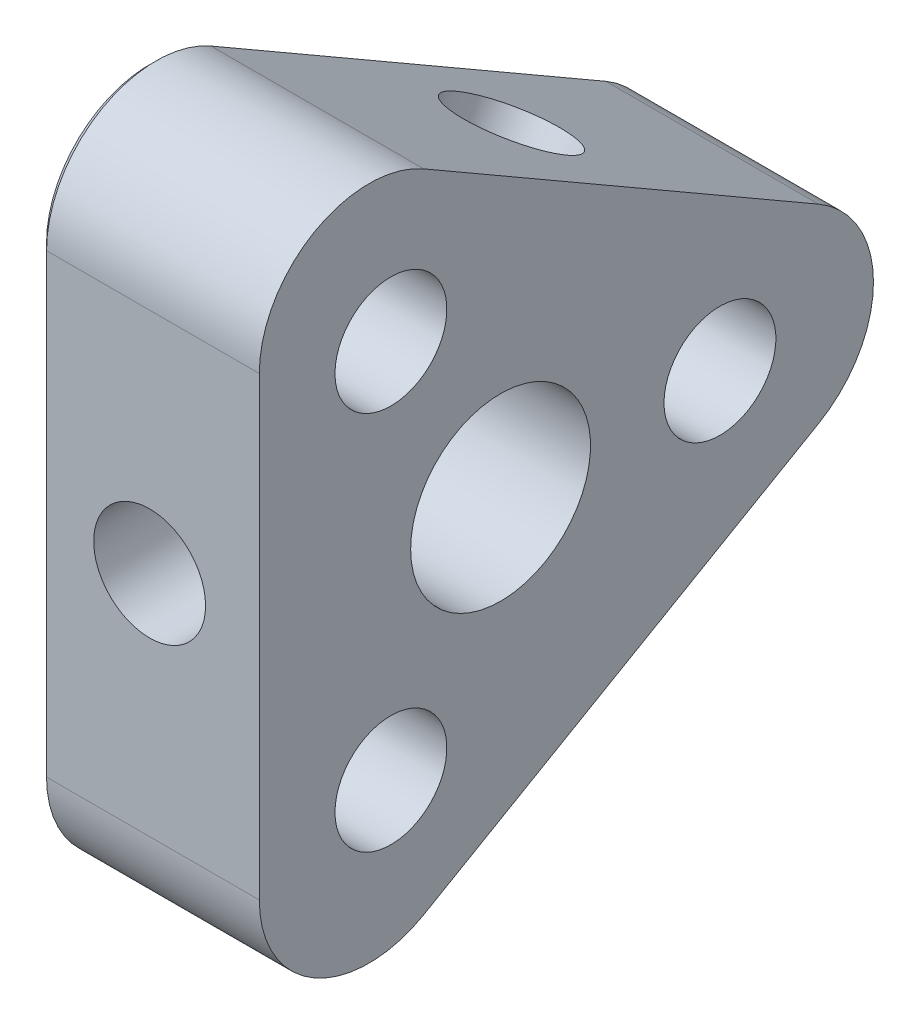
ISO-10303-21;
HEADER;
FILE_DESCRIPTION(('STEP AP214'),'2;1');
FILE_NAME('part.step','',(''),(''),'','','');
FILE_SCHEMA(('AUTOMOTIVE_DESIGN { 1 0 10303 214 1 1 1 1 }'));
ENDSEC;
DATA;
#1=APPLICATION_CONTEXT('core data for automotive mechanical design processes');
#2=APPLICATION_PROTOCOL_DEFINITION('international standard','automotive_design',2000,#1);
#3=PRODUCT_CONTEXT('',#1,'mechanical');
#4=PRODUCT('Part','Part','',(#3));
#5=PRODUCT_RELATED_PRODUCT_CATEGORY('part','',(#4));
#6=PRODUCT_DEFINITION_FORMATION('','',#4);
#7=PRODUCT_DEFINITION_CONTEXT('part definition',#1,'design');
#8=PRODUCT_DEFINITION('design','',#6,#7);
#9=PRODUCT_DEFINITION_SHAPE('','',#8);
#10=(LENGTH_UNIT() NAMED_UNIT(*) SI_UNIT(.MILLI.,.METRE.));
#11=(NAMED_UNIT(*) PLANE_ANGLE_UNIT() SI_UNIT($,.RADIAN.));
#12=(NAMED_UNIT(*) SI_UNIT($,.STERADIAN.) SOLID_ANGLE_UNIT());
#13=UNCERTAINTY_MEASURE_WITH_UNIT(LENGTH_MEASURE(1.E-05),#10,'distance_accuracy_value','');
#14=(GEOMETRIC_REPRESENTATION_CONTEXT(3) GLOBAL_UNCERTAINTY_ASSIGNED_CONTEXT((#13)) GLOBAL_UNIT_ASSIGNED_CONTEXT((#10,
#11,#12)) REPRESENTATION_CONTEXT('',''));
#15=CARTESIAN_POINT('',(0.,0.,0.));
#16=DIRECTION('',(0.,0.,1.));
#17=DIRECTION('',(1.,0.,0.));
#18=AXIS2_PLACEMENT_3D('',#15,#16,#17);
#19=CARTESIAN_POINT('',(38.,10.3923048454133,6.));
#20=DIRECTION('',(-1.,0.,0.));
#21=DIRECTION('',(0.,0.,1.));
#22=AXIS2_PLACEMENT_3D('',#19,#20,#21);
#23=CYLINDRICAL_SURFACE('',#22,4.99999999999999);
#24=DIRECTION('',(-1.,0.,0.));
#25=VECTOR('',#24,1.);
#26=CARTESIAN_POINT('',(38.,14.7224318643355,3.50000000000001));
#27=LINE('',#26,#25);
#28=CARTESIAN_POINT('',(38.,14.7224318643355,3.50000000000001));
#29=VERTEX_POINT('',#28);
#30=CARTESIAN_POINT('',(28.3000000000062,14.7224318643355,3.50000000000001));
#31=VERTEX_POINT('',#30);
#32=EDGE_CURVE('E110',#29,#31,#27,.T.);
#33=ORIENTED_EDGE('',*,*,#32,.T.);
#34=CARTESIAN_POINT('',(28.3000000000062,10.3923048454133,6.));
#35=DIRECTION('',(-1.,0.,0.));
#36=DIRECTION('',(0.,0.,1.));
#37=AXIS2_PLACEMENT_3D('',#34,#35,#36);
#38=CIRCLE('',#37,4.99999999999999);
#39=CARTESIAN_POINT('',(28.3000000000062,10.3923048454133,11.));
#40=VERTEX_POINT('',#39);
#41=EDGE_CURVE('E193',#31,#40,#38,.F.);
#42=ORIENTED_EDGE('',*,*,#41,.T.);
#43=DIRECTION('',(-1.,0.,0.));
#44=VECTOR('',#43,1.);
#45=CARTESIAN_POINT('',(38.,10.3923048454133,11.));
#46=LINE('',#45,#44);
#47=CARTESIAN_POINT('',(38.,10.3923048454133,11.));
#48=VERTEX_POINT('',#47);
#49=EDGE_CURVE('E132',#48,#40,#46,.T.);
#50=ORIENTED_EDGE('',*,*,#49,.F.);
#51=CARTESIAN_POINT('',(38.,10.3923048454133,6.));
#52=DIRECTION('',(-1.,0.,0.));
#53=DIRECTION('',(0.,0.,1.));
#54=AXIS2_PLACEMENT_3D('',#51,#52,#53);
#55=CIRCLE('',#54,4.99999999999999);
#56=EDGE_CURVE('E125',#48,#29,#55,.T.);
#57=ORIENTED_EDGE('',*,*,#56,.T.);
#58=EDGE_LOOP('',(#33,#42,#50,#57));
#59=FACE_BOUND('',#58,.T.);
#60=ADVANCED_FACE('F33',(#59),#23,.T.);
#61=CARTESIAN_POINT('',(38.,-10.3923048454133,11.));
#62=DIRECTION('',(0.,0.,1.));
#63=DIRECTION('',(1.,0.,0.));
#64=AXIS2_PLACEMENT_3D('',#61,#62,#63);
#65=PLANE('',#64);
#66=CARTESIAN_POINT('',(33.,0.,11.));
#67=DIRECTION('',(0.,0.,1.));
#68=DIRECTION('',(1.,0.,0.));
#69=AXIS2_PLACEMENT_3D('',#66,#67,#68);
#70=CIRCLE('',#69,2.54999999999998);
#71=CARTESIAN_POINT('',(35.55,0.,11.));
#72=VERTEX_POINT('',#71);
#73=EDGE_CURVE('E216',#72,#72,#70,.T.);
#74=ORIENTED_EDGE('',*,*,#73,.F.);
#75=EDGE_LOOP('',(#74));
#76=FACE_BOUND('',#75,.T.);
#77=ORIENTED_EDGE('',*,*,#49,.T.);
#78=DIRECTION('',(0.,-1.,0.));
#79=VECTOR('',#78,1.);
#80=CARTESIAN_POINT('',(28.3000000000062,-10.3923048454133,11.));
#81=LINE('',#80,#79);
#82=CARTESIAN_POINT('',(28.3000000000062,-10.3923048454133,11.));
#83=VERTEX_POINT('',#82);
#84=EDGE_CURVE('E189',#40,#83,#81,.T.);
#85=ORIENTED_EDGE('',*,*,#84,.T.);
#86=DIRECTION('',(-1.,0.,0.));
#87=VECTOR('',#86,1.);
#88=CARTESIAN_POINT('',(38.,-10.3923048454133,11.));
#89=LINE('',#88,#87);
#90=CARTESIAN_POINT('',(38.,-10.3923048454133,11.));
#91=VERTEX_POINT('',#90);
#92=EDGE_CURVE('E150',#91,#83,#89,.T.);
#93=ORIENTED_EDGE('',*,*,#92,.F.);
#94=DIRECTION('',(0.,1.,0.));
#95=VECTOR('',#94,1.);
#96=CARTESIAN_POINT('',(38.,-10.3923048454133,11.));
#97=LINE('',#96,#95);
#98=EDGE_CURVE('E118',#91,#48,#97,.T.);
#99=ORIENTED_EDGE('',*,*,#98,.T.);
#100=EDGE_LOOP('',(#77,#85,#93,#99));
#101=FACE_BOUND('',#100,.T.);
#102=ADVANCED_FACE('F256',(#76,#101),#65,.T.);
#103=CARTESIAN_POINT('',(38.,-10.3923048454133,6.));
#104=DIRECTION('',(-1.,0.,0.));
#105=DIRECTION('',(0.,0.,1.));
#106=AXIS2_PLACEMENT_3D('',#103,#104,#105);
#107=CYLINDRICAL_SURFACE('',#106,4.99999999999999);
#108=ORIENTED_EDGE('',*,*,#92,.T.);
#109=CARTESIAN_POINT('',(28.3000000000062,-10.3923048454133,6.));
#110=DIRECTION('',(-1.,0.,0.));
#111=DIRECTION('',(0.,0.,1.));
#112=AXIS2_PLACEMENT_3D('',#109,#110,#111);
#113=CIRCLE('',#112,4.99999999999999);
#114=CARTESIAN_POINT('',(28.3000000000062,-14.7224318643355,3.50000000000001));
#115=VERTEX_POINT('',#114);
#116=EDGE_CURVE('E186',#83,#115,#113,.F.);
#117=ORIENTED_EDGE('',*,*,#116,.T.);
#118=DIRECTION('',(-1.,0.,0.));
#119=VECTOR('',#118,1.);
#120=CARTESIAN_POINT('',(38.,-14.7224318643355,3.50000000000001));
#121=LINE('',#120,#119);
#122=CARTESIAN_POINT('',(38.,-14.7224318643355,3.50000000000001));
#123=VERTEX_POINT('',#122);
#124=EDGE_CURVE('E153',#123,#115,#121,.T.);
#125=ORIENTED_EDGE('',*,*,#124,.F.);
#126=CARTESIAN_POINT('',(38.,-10.3923048454133,6.));
#127=DIRECTION('',(-1.,0.,0.));
#128=DIRECTION('',(0.,0.,1.));
#129=AXIS2_PLACEMENT_3D('',#126,#127,#128);
#130=CIRCLE('',#129,4.99999999999999);
#131=EDGE_CURVE('E144',#123,#91,#130,.T.);
#132=ORIENTED_EDGE('',*,*,#131,.T.);
#133=EDGE_LOOP('',(#108,#117,#125,#132));
#134=FACE_BOUND('',#133,.T.);
#135=ADVANCED_FACE('F261',(#134),#107,.T.);
#136=CARTESIAN_POINT('',(38.,-4.33012701892219,-14.5));
#137=DIRECTION('',(0.,-0.866025403784438,-0.500000000000001));
#138=DIRECTION('',(0.,0.500000000000001,-0.866025403784438));
#139=AXIS2_PLACEMENT_3D('',#136,#137,#138);
#140=PLANE('',#139);
#141=ORIENTED_EDGE('',*,*,#124,.T.);
#142=DIRECTION('',(0.,0.500000000000001,-0.866025403784438));
#143=VECTOR('',#142,1.);
#144=CARTESIAN_POINT('',(28.3000000000062,-4.33012701892219,-14.5));
#145=LINE('',#144,#143);
#146=CARTESIAN_POINT('',(28.3000000000062,-4.33012701892219,-14.5));
#147=VERTEX_POINT('',#146);
#148=EDGE_CURVE('E191',#115,#147,#145,.T.);
#149=ORIENTED_EDGE('',*,*,#148,.T.);
#150=DIRECTION('',(-1.,0.,0.));
#151=VECTOR('',#150,1.);
#152=CARTESIAN_POINT('',(38.,-4.33012701892219,-14.5));
#153=LINE('',#152,#151);
#154=CARTESIAN_POINT('',(38.,-4.33012701892219,-14.5));
#155=VERTEX_POINT('',#154);
#156=EDGE_CURVE('E156',#155,#147,#153,.T.);
#157=ORIENTED_EDGE('',*,*,#156,.F.);
#158=DIRECTION('',(0.,-0.500000000000001,0.866025403784438));
#159=VECTOR('',#158,1.);
#160=CARTESIAN_POINT('',(38.,-4.33012701892219,-14.5));
#161=LINE('',#160,#159);
#162=EDGE_CURVE('E141',#155,#123,#161,.T.);
#163=ORIENTED_EDGE('',*,*,#162,.T.);
#164=EDGE_LOOP('',(#141,#149,#157,#163));
#165=FACE_BOUND('',#164,.T.);
#166=ADVANCED_FACE('F343',(#165),#140,.T.);
#167=CARTESIAN_POINT('',(38.,0.,-12.));
#168=DIRECTION('',(-1.,0.,0.));
#169=DIRECTION('',(0.,0.,1.));
#170=AXIS2_PLACEMENT_3D('',#167,#168,#169);
#171=CYLINDRICAL_SURFACE('',#170,5.);
#172=ORIENTED_EDGE('',*,*,#156,.T.);
#173=CARTESIAN_POINT('',(28.3000000000062,0.,-12.));
#174=DIRECTION('',(-1.,0.,0.));
#175=DIRECTION('',(0.,0.,1.));
#176=AXIS2_PLACEMENT_3D('',#173,#174,#175);
#177=CIRCLE('',#176,5.);
#178=CARTESIAN_POINT('',(28.3000000000062,4.3301270189222,-14.5));
#179=VERTEX_POINT('',#178);
#180=EDGE_CURVE('E55',#147,#179,#177,.F.);
#181=ORIENTED_EDGE('',*,*,#180,.T.);
#182=DIRECTION('',(-1.,0.,0.));
#183=VECTOR('',#182,1.);
#184=CARTESIAN_POINT('',(38.,4.3301270189222,-14.5));
#185=LINE('',#184,#183);
#186=CARTESIAN_POINT('',(38.,4.3301270189222,-14.5));
#187=VERTEX_POINT('',#186);
#188=EDGE_CURVE('E117',#187,#179,#185,.T.);
#189=ORIENTED_EDGE('',*,*,#188,.F.);
#190=CARTESIAN_POINT('',(38.,0.,-12.));
#191=DIRECTION('',(-1.,0.,0.));
#192=DIRECTION('',(0.,0.,1.));
#193=AXIS2_PLACEMENT_3D('',#190,#191,#192);
#194=CIRCLE('',#193,5.);
#195=EDGE_CURVE('E129',#187,#155,#194,.T.);
#196=ORIENTED_EDGE('',*,*,#195,.T.);
#197=EDGE_LOOP('',(#172,#181,#189,#196));
#198=FACE_BOUND('',#197,.T.);
#199=ADVANCED_FACE('F346',(#198),#171,.T.);
#200=CARTESIAN_POINT('',(38.,14.7224318643355,3.50000000000001));
#201=DIRECTION('',(0.,0.866025403784438,-0.5));
#202=DIRECTION('',(0.,0.5,0.866025403784438));
#203=AXIS2_PLACEMENT_3D('',#200,#201,#202);
#204=PLANE('',#203);
#205=CARTESIAN_POINT('',(33.,9.52743186433548,-5.49800394532031));
#206=DIRECTION('',(0.,0.866025403784438,-0.500000000000001));
#207=DIRECTION('',(0.,0.500000000000001,0.866025403784438));
#208=AXIS2_PLACEMENT_3D('',#205,#206,#207);
#209=CIRCLE('',#208,2.525);
#210=CARTESIAN_POINT('',(33.,10.7899318643355,-3.3112898007646));
#211=VERTEX_POINT('',#210);
#212=EDGE_CURVE('E229',#211,#211,#209,.T.);
#213=ORIENTED_EDGE('',*,*,#212,.F.);
#214=EDGE_LOOP('',(#213));
#215=FACE_BOUND('',#214,.T.);
#216=ORIENTED_EDGE('',*,*,#188,.T.);
#217=DIRECTION('',(0.,0.5,0.866025403784438));
#218=VECTOR('',#217,1.);
#219=CARTESIAN_POINT('',(28.3000000000062,14.7224318643355,3.50000000000001));
#220=LINE('',#219,#218);
#221=EDGE_CURVE('E62',#179,#31,#220,.T.);
#222=ORIENTED_EDGE('',*,*,#221,.T.);
#223=ORIENTED_EDGE('',*,*,#32,.F.);
#224=DIRECTION('',(0.,-0.5,-0.866025403784438));
#225=VECTOR('',#224,1.);
#226=CARTESIAN_POINT('',(38.,14.7224318643355,3.50000000000001));
#227=LINE('',#226,#225);
#228=EDGE_CURVE('E113',#29,#187,#227,.T.);
#229=ORIENTED_EDGE('',*,*,#228,.T.);
#230=EDGE_LOOP('',(#216,#222,#223,#229));
#231=FACE_BOUND('',#230,.T.);
#232=ADVANCED_FACE('F112',(#215,#231),#204,.T.);
#233=CARTESIAN_POINT('',(38.,10.3923048454133,6.));
#234=DIRECTION('',(-1.,0.,0.));
#235=DIRECTION('',(0.,0.,1.));
#236=AXIS2_PLACEMENT_3D('',#233,#234,#235);
#237=PLANE('',#236);
#238=CARTESIAN_POINT('',(38.,0.,0.));
#239=DIRECTION('',(-1.,0.,0.));
#240=DIRECTION('',(0.,0.,1.));
#241=AXIS2_PLACEMENT_3D('',#238,#239,#240);
#242=CIRCLE('',#241,4.09999999999999);
#243=CARTESIAN_POINT('',(38.,0.,4.09999999999999));
#244=VERTEX_POINT('',#243);
#245=EDGE_CURVE('E226',#244,#244,#242,.T.);
#246=ORIENTED_EDGE('',*,*,#245,.T.);
#247=EDGE_LOOP('',(#246));
#248=FACE_BOUND('',#247,.T.);
#249=CARTESIAN_POINT('',(38.,0.,-10.));
#250=DIRECTION('',(-1.,0.,0.));
#251=DIRECTION('',(0.,0.,1.));
#252=AXIS2_PLACEMENT_3D('',#249,#250,#251);
#253=CIRCLE('',#252,2.54999999999999);
#254=CARTESIAN_POINT('',(38.,0.,-7.45000000000001));
#255=VERTEX_POINT('',#254);
#256=EDGE_CURVE('E313',#255,#255,#253,.T.);
#257=ORIENTED_EDGE('',*,*,#256,.T.);
#258=EDGE_LOOP('',(#257));
#259=FACE_BOUND('',#258,.T.);
#260=CARTESIAN_POINT('',(38.,8.66025403784439,5.));
#261=DIRECTION('',(-1.,0.,0.));
#262=DIRECTION('',(0.,0.,1.));
#263=AXIS2_PLACEMENT_3D('',#260,#261,#262);
#264=CIRCLE('',#263,2.54999999999999);
#265=CARTESIAN_POINT('',(38.,8.66025403784439,7.54999999999999));
#266=VERTEX_POINT('',#265);
#267=EDGE_CURVE('E136',#266,#266,#264,.T.);
#268=ORIENTED_EDGE('',*,*,#267,.T.);
#269=EDGE_LOOP('',(#268));
#270=FACE_BOUND('',#269,.T.);
#271=CARTESIAN_POINT('',(38.,-8.66025403784439,5.));
#272=DIRECTION('',(-1.,0.,0.));
#273=DIRECTION('',(0.,0.,1.));
#274=AXIS2_PLACEMENT_3D('',#271,#272,#273);
#275=CIRCLE('',#274,2.54999999999999);
#276=CARTESIAN_POINT('',(38.,-8.66025403784439,7.54999999999999));
#277=VERTEX_POINT('',#276);
#278=EDGE_CURVE('E133',#277,#277,#275,.T.);
#279=ORIENTED_EDGE('',*,*,#278,.T.);
#280=EDGE_LOOP('',(#279));
#281=FACE_BOUND('',#280,.T.);
#282=ORIENTED_EDGE('',*,*,#56,.F.);
#283=ORIENTED_EDGE('',*,*,#98,.F.);
#284=ORIENTED_EDGE('',*,*,#131,.F.);
#285=ORIENTED_EDGE('',*,*,#162,.F.);
#286=ORIENTED_EDGE('',*,*,#195,.F.);
#287=ORIENTED_EDGE('',*,*,#228,.F.);
#288=EDGE_LOOP('',(#282,#283,#284,#285,#286,#287));
#289=FACE_BOUND('',#288,.T.);
#290=ADVANCED_FACE('F123',(#248,#259,#270,#281,#289),#237,.F.);
#291=CARTESIAN_POINT('',(28.,10.3923048454133,6.));
#292=DIRECTION('',(-1.,0.,0.));
#293=DIRECTION('',(0.,0.,1.));
#294=AXIS2_PLACEMENT_3D('',#291,#292,#293);
#295=PLANE('',#294);
#296=CARTESIAN_POINT('',(28.,0.,-10.));
#297=DIRECTION('',(-1.,0.,0.));
#298=DIRECTION('',(0.,0.,1.));
#299=AXIS2_PLACEMENT_3D('',#296,#297,#298);
#300=CIRCLE('',#299,2.85000000000617);
#301=CARTESIAN_POINT('',(28.,0.,-7.14999999999383));
#302=VERTEX_POINT('',#301);
#303=EDGE_CURVE('E183',#302,#302,#300,.F.);
#304=ORIENTED_EDGE('',*,*,#303,.T.);
#305=EDGE_LOOP('',(#304));
#306=FACE_BOUND('',#305,.T.);
#307=DIRECTION('',(0.,-0.500000000000001,0.866025403784438));
#308=VECTOR('',#307,1.);
#309=CARTESIAN_POINT('',(28.,-9.26647182048812,-5.34999999999694));
#310=LINE('',#309,#308);
#311=CARTESIAN_POINT('',(28.,-4.0703193977815,-14.3499999999969));
#312=VERTEX_POINT('',#311);
#313=CARTESIAN_POINT('',(28.,-14.4626242431948,3.6500000000031));
#314=VERTEX_POINT('',#313);
#315=EDGE_CURVE('E176',#312,#314,#310,.T.);
#316=ORIENTED_EDGE('',*,*,#315,.T.);
#317=CARTESIAN_POINT('',(28.,-10.3923048454133,6.));
#318=DIRECTION('',(-1.,0.,0.));
#319=DIRECTION('',(0.,0.,1.));
#320=AXIS2_PLACEMENT_3D('',#317,#318,#319);
#321=CIRCLE('',#320,4.6999999999938);
#322=CARTESIAN_POINT('',(28.,-10.3923048454133,10.6999999999938));
#323=VERTEX_POINT('',#322);
#324=EDGE_CURVE('E180',#314,#323,#321,.T.);
#325=ORIENTED_EDGE('',*,*,#324,.T.);
#326=DIRECTION('',(0.,1.,0.));
#327=VECTOR('',#326,1.);
#328=CARTESIAN_POINT('',(28.,10.3923048454133,10.6999999999938));
#329=LINE('',#328,#327);
#330=CARTESIAN_POINT('',(28.,10.3923048454133,10.6999999999938));
#331=VERTEX_POINT('',#330);
#332=EDGE_CURVE('E178',#323,#331,#329,.T.);
#333=ORIENTED_EDGE('',*,*,#332,.T.);
#334=CARTESIAN_POINT('',(28.,10.3923048454133,6.));
#335=DIRECTION('',(-1.,0.,0.));
#336=DIRECTION('',(0.,0.,1.));
#337=AXIS2_PLACEMENT_3D('',#334,#335,#336);
#338=CIRCLE('',#337,4.6999999999938);
#339=CARTESIAN_POINT('',(28.,14.4626242431948,3.6500000000031));
#340=VERTEX_POINT('',#339);
#341=EDGE_CURVE('E174',#331,#340,#338,.T.);
#342=ORIENTED_EDGE('',*,*,#341,.T.);
#343=DIRECTION('',(0.,-0.5,-0.866025403784438));
#344=VECTOR('',#343,1.);
#345=CARTESIAN_POINT('',(28.,14.4626242431948,3.6500000000031));
#346=LINE('',#345,#344);
#347=CARTESIAN_POINT('',(28.,4.07031939778151,-14.3499999999969));
#348=VERTEX_POINT('',#347);
#349=EDGE_CURVE('E170',#340,#348,#346,.T.);
#350=ORIENTED_EDGE('',*,*,#349,.T.);
#351=CARTESIAN_POINT('',(28.,0.,-12.));
#352=DIRECTION('',(-1.,0.,0.));
#353=DIRECTION('',(0.,0.,1.));
#354=AXIS2_PLACEMENT_3D('',#351,#352,#353);
#355=CIRCLE('',#354,4.69999999999381);
#356=EDGE_CURVE('E172',#348,#312,#355,.T.);
#357=ORIENTED_EDGE('',*,*,#356,.T.);
#358=EDGE_LOOP('',(#316,#325,#333,#342,#350,#357));
#359=FACE_BOUND('',#358,.T.);
#360=CARTESIAN_POINT('',(28.,-8.66025403784439,5.));
#361=DIRECTION('',(-1.,0.,0.));
#362=DIRECTION('',(0.,0.,1.));
#363=AXIS2_PLACEMENT_3D('',#360,#361,#362);
#364=CIRCLE('',#363,2.85000000000617);
#365=CARTESIAN_POINT('',(28.,-8.66025403784439,7.85000000000617));
#366=VERTEX_POINT('',#365);
#367=EDGE_CURVE('E167',#366,#366,#364,.F.);
#368=ORIENTED_EDGE('',*,*,#367,.T.);
#369=EDGE_LOOP('',(#368));
#370=FACE_BOUND('',#369,.T.);
#371=CARTESIAN_POINT('',(28.,8.66025403784439,5.));
#372=DIRECTION('',(-1.,0.,0.));
#373=DIRECTION('',(0.,0.,1.));
#374=AXIS2_PLACEMENT_3D('',#371,#372,#373);
#375=CIRCLE('',#374,2.85000000000617);
#376=CARTESIAN_POINT('',(28.,8.66025403784439,7.85000000000617));
#377=VERTEX_POINT('',#376);
#378=EDGE_CURVE('E164',#377,#377,#375,.F.);
#379=ORIENTED_EDGE('',*,*,#378,.T.);
#380=EDGE_LOOP('',(#379));
#381=FACE_BOUND('',#380,.T.);
#382=CARTESIAN_POINT('',(28.,0.,0.));
#383=DIRECTION('',(-1.,0.,0.));
#384=DIRECTION('',(0.,0.,1.));
#385=AXIS2_PLACEMENT_3D('',#382,#383,#384);
#386=CIRCLE('',#385,4.40000000000617);
#387=CARTESIAN_POINT('',(28.,0.,4.40000000000617));
#388=VERTEX_POINT('',#387);
#389=EDGE_CURVE('E161',#388,#388,#386,.F.);
#390=ORIENTED_EDGE('',*,*,#389,.T.);
#391=EDGE_LOOP('',(#390));
#392=FACE_BOUND('',#391,.T.);
#393=ADVANCED_FACE('F334',(#306,#359,#370,#381,#392),#295,.T.);
#394=CARTESIAN_POINT('',(28.,-8.66025403784439,5.));
#395=DIRECTION('',(-1.,0.,0.));
#396=DIRECTION('',(0.,0.,1.));
#397=AXIS2_PLACEMENT_3D('',#394,#395,#396);
#398=CYLINDRICAL_SURFACE('',#397,2.54999999999999);
#399=CARTESIAN_POINT('',(28.3000000000062,-8.66025403784439,5.));
#400=DIRECTION('',(-1.,0.,0.));
#401=DIRECTION('',(0.,0.,1.));
#402=AXIS2_PLACEMENT_3D('',#399,#400,#401);
#403=CIRCLE('',#402,2.54999999999999);
#404=CARTESIAN_POINT('',(28.3000000000062,-8.66025403784439,7.54999999999999));
#405=VERTEX_POINT('',#404);
#406=EDGE_CURVE('E197',#405,#405,#403,.T.);
#407=ORIENTED_EDGE('',*,*,#406,.T.);
#408=EDGE_LOOP('',(#407));
#409=FACE_BOUND('',#408,.T.);
#410=ORIENTED_EDGE('',*,*,#278,.F.);
#411=EDGE_LOOP('',(#410));
#412=FACE_BOUND('',#411,.T.);
#413=ADVANCED_FACE('F308',(#409,#412),#398,.F.);
#414=CARTESIAN_POINT('',(28.,8.66025403784439,5.));
#415=DIRECTION('',(-1.,0.,0.));
#416=DIRECTION('',(0.,0.,1.));
#417=AXIS2_PLACEMENT_3D('',#414,#415,#416);
#418=CYLINDRICAL_SURFACE('',#417,2.54999999999999);
#419=CARTESIAN_POINT('',(28.3000000000062,8.66025403784439,5.));
#420=DIRECTION('',(-1.,0.,0.));
#421=DIRECTION('',(0.,0.,1.));
#422=AXIS2_PLACEMENT_3D('',#419,#420,#421);
#423=CIRCLE('',#422,2.54999999999999);
#424=CARTESIAN_POINT('',(28.3000000000062,8.66025403784439,7.54999999999999));
#425=VERTEX_POINT('',#424);
#426=EDGE_CURVE('E47',#425,#425,#423,.T.);
#427=ORIENTED_EDGE('',*,*,#426,.T.);
#428=EDGE_LOOP('',(#427));
#429=FACE_BOUND('',#428,.T.);
#430=ORIENTED_EDGE('',*,*,#267,.F.);
#431=EDGE_LOOP('',(#430));
#432=FACE_BOUND('',#431,.T.);
#433=ADVANCED_FACE('F304',(#429,#432),#418,.F.);
#434=CARTESIAN_POINT('',(28.,0.,-10.));
#435=DIRECTION('',(-1.,0.,0.));
#436=DIRECTION('',(0.,0.,1.));
#437=AXIS2_PLACEMENT_3D('',#434,#435,#436);
#438=CYLINDRICAL_SURFACE('',#437,2.54999999999999);
#439=CARTESIAN_POINT('',(28.3000000000062,0.,-10.));
#440=DIRECTION('',(-1.,0.,0.));
#441=DIRECTION('',(0.,0.,1.));
#442=AXIS2_PLACEMENT_3D('',#439,#440,#441);
#443=CIRCLE('',#442,2.54999999999999);
#444=CARTESIAN_POINT('',(28.3000000000062,0.,-7.45000000000001));
#445=VERTEX_POINT('',#444);
#446=EDGE_CURVE('E149',#445,#445,#443,.T.);
#447=ORIENTED_EDGE('',*,*,#446,.T.);
#448=EDGE_LOOP('',(#447));
#449=FACE_BOUND('',#448,.T.);
#450=ORIENTED_EDGE('',*,*,#256,.F.);
#451=EDGE_LOOP('',(#450));
#452=FACE_BOUND('',#451,.T.);
#453=ADVANCED_FACE('F307',(#449,#452),#438,.F.);
#454=CARTESIAN_POINT('',(28.,0.,0.));
#455=DIRECTION('',(-1.,0.,0.));
#456=DIRECTION('',(0.,0.,1.));
#457=AXIS2_PLACEMENT_3D('',#454,#455,#456);
#458=CYLINDRICAL_SURFACE('',#457,4.09999999999999);
#459=CARTESIAN_POINT('',(33.,4.05955078705446,0.574497525952365));
#460=CARTESIAN_POINT('',(33.0629980161948,4.0595513242228,0.574496450626295));
#461=CARTESIAN_POINT('',(33.126014050175,4.05997580986867,0.57152239236077));
#462=CARTESIAN_POINT('',(33.2514978545031,4.06161866897016,0.559717246023028));
#463=CARTESIAN_POINT('',(33.3139652448139,4.06283755454728,0.550882379629771));
#464=CARTESIAN_POINT('',(33.5000053466568,4.06749382535164,0.515835777868444));
#465=CARTESIAN_POINT('',(33.6220280704134,4.07193017044525,0.481082975800415));
#466=CARTESIAN_POINT('',(33.8574079466871,4.0814260024777,0.392292100402566));
#467=CARTESIAN_POINT('',(33.9708289256393,4.08647997932577,0.338417412141292));
#468=CARTESIAN_POINT('',(34.1885449740641,4.09484592956604,0.21467062103673));
#469=CARTESIAN_POINT('',(34.2928402988493,4.09815795170669,0.144798965945623));
#470=CARTESIAN_POINT('',(34.504232495765,4.10086844847617,-0.0180689229129287));
#471=CARTESIAN_POINT('',(34.6099305897763,4.09970211251285,-0.112890600086515));
#472=CARTESIAN_POINT('',(34.8071267464374,4.08907475856466,-0.315984010972013));
#473=CARTESIAN_POINT('',(34.8986126343991,4.07960667462565,-0.424267134870731));
#474=CARTESIAN_POINT('',(35.0753744381022,4.04778879636428,-0.664587109290982));
#475=CARTESIAN_POINT('',(35.1586899860116,4.02406863470168,-0.797921875693083));
#476=CARTESIAN_POINT('',(35.266168192565,3.97583248372511,-1.00387590423365));
#477=CARTESIAN_POINT('',(35.2990855052607,3.95763724322931,-1.07354056476827));
#478=CARTESIAN_POINT('',(35.3586732286396,3.91676800310794,-1.21419675388939));
#479=CARTESIAN_POINT('',(35.3853478858039,3.89409706747904,-1.28518734482717));
#480=CARTESIAN_POINT('',(35.4297219813844,3.84659623655902,-1.42068070461386));
#481=CARTESIAN_POINT('',(35.4480477882039,3.82220094720279,-1.48513150018376));
#482=CARTESIAN_POINT('',(35.4790063679954,3.76966270339287,-1.61383708858661));
#483=CARTESIAN_POINT('',(35.4916423873889,3.74152189792408,-1.67809197235965));
#484=CARTESIAN_POINT('',(35.51101679834,3.68160573890183,-1.80575304478016));
#485=CARTESIAN_POINT('',(35.5177586671412,3.64983254080051,-1.86915971205887));
#486=CARTESIAN_POINT('',(35.5252449919549,3.58288675727969,-1.99448772948591));
#487=CARTESIAN_POINT('',(35.5259901106781,3.54771454792529,-2.05640924300694));
#488=CARTESIAN_POINT('',(35.519770980482,3.44718194553075,-2.22308978304423));
#489=CARTESIAN_POINT('',(35.5067234039133,3.37866944721236,-2.32580380905104));
#490=CARTESIAN_POINT('',(35.463089848834,3.23474782138227,-2.52215576577145));
#491=CARTESIAN_POINT('',(35.4325025601444,3.15933817902246,-2.61579301785862));
#492=CARTESIAN_POINT('',(35.3550787732168,3.00415154646016,-2.79266282360067));
#493=CARTESIAN_POINT('',(35.3081853378905,2.92436008911289,-2.87585751049088));
#494=CARTESIAN_POINT('',(35.1998862671631,2.76354030241642,-3.03073111141238));
#495=CARTESIAN_POINT('',(35.1384771634632,2.68251168180068,-3.10240726637902));
#496=CARTESIAN_POINT('',(34.9944374908891,2.51211551493995,-3.24235501898265));
#497=CARTESIAN_POINT('',(34.910128805618,2.42294239960589,-3.30913394334941));
#498=CARTESIAN_POINT('',(34.7270144543608,2.2502050891315,-3.42894386965015));
#499=CARTESIAN_POINT('',(34.6281882518096,2.16664908816546,-3.48195509673026));
#500=CARTESIAN_POINT('',(34.4042716341256,1.99942337217078,-3.58090312430439));
#501=CARTESIAN_POINT('',(34.2774421739182,1.91704739691503,-3.62512498149386));
#502=CARTESIAN_POINT('',(34.0092021224868,1.77159732212663,-3.69839193362512));
#503=CARTESIAN_POINT('',(33.8678189961773,1.70848772569182,-3.72746500983567));
#504=CARTESIAN_POINT('',(33.6115524414574,1.62206004403602,-3.76570777192965));
#505=CARTESIAN_POINT('',(33.4991919345154,1.59268464275692,-3.77807185784592));
#506=CARTESIAN_POINT('',(33.2707543943982,1.55171340049319,-3.79508870372342));
#507=CARTESIAN_POINT('',(33.1546823443323,1.54009466475497,-3.79975139419214));
#508=CARTESIAN_POINT('',(32.9219123127252,1.53593107517876,-3.80143704302572));
#509=CARTESIAN_POINT('',(32.8052135554526,1.54342308154676,-3.79844523760311));
#510=CARTESIAN_POINT('',(32.5748846527431,1.57667500744686,-3.78475909076844));
#511=CARTESIAN_POINT('',(32.4612570881467,1.60244982383876,-3.77405846808991));
#512=CARTESIAN_POINT('',(32.2410546582868,1.66927255839268,-3.74497293515519));
#513=CARTESIAN_POINT('',(32.1344179701414,1.71015625921493,-3.72667039381781));
#514=CARTESIAN_POINT('',(31.9284568751346,1.80407553642125,-3.68211998686687));
#515=CARTESIAN_POINT('',(31.8291351337107,1.85711551367367,-3.6558692427024));
#516=CARTESIAN_POINT('',(31.6209523926508,1.9831297021889,-3.58931265791428));
#517=CARTESIAN_POINT('',(31.5137707907746,2.0579768182665,-3.54729800802938));
#518=CARTESIAN_POINT('',(31.3121548359725,2.21630958655234,-3.45059280090538));
#519=CARTESIAN_POINT('',(31.2177335474803,2.2998039399472,-3.39588940579913));
#520=CARTESIAN_POINT('',(31.0301218027566,2.4843970294909,-3.26381527994209));
#521=CARTESIAN_POINT('',(30.9391900378229,2.58627032076026,-3.1842861656288));
#522=CARTESIAN_POINT('',(30.7789641865072,2.79093953946331,-3.00648230262509));
#523=CARTESIAN_POINT('',(30.7096581245987,2.89373492371293,-2.90821797755765));
#524=CARTESIAN_POINT('',(30.6264342884322,3.04086138327309,-2.75098409739601));
#525=CARTESIAN_POINT('',(30.602665380068,3.0872014772274,-2.69892144189455));
#526=CARTESIAN_POINT('',(30.5609517234533,3.1781987858951,-2.59114089793546));
#527=CARTESIAN_POINT('',(30.5430036431134,3.22285695042848,-2.53542512271811));
#528=CARTESIAN_POINT('',(30.5132344258771,3.30987359027026,-2.42072577390676));
#529=CARTESIAN_POINT('',(30.5014084085243,3.35223387323674,-2.36174484491875));
#530=CARTESIAN_POINT('',(30.4840651977668,3.43413364996551,-2.24099519080912));
#531=CARTESIAN_POINT('',(30.4785470495132,3.47367356980829,-2.17922688909578));
#532=CARTESIAN_POINT('',(30.4723016189108,3.57653904982791,-2.008515611963));
#533=CARTESIAN_POINT('',(30.4778003410226,3.63671038001369,-1.89735389940744));
#534=CARTESIAN_POINT('',(30.5074165629125,3.74564776386578,-1.67207017665014));
#535=CARTESIAN_POINT('',(30.5315336829238,3.79441405013882,-1.5579482268754));
#536=CARTESIAN_POINT('',(30.5962268318318,3.87892414553478,-1.33339944125825));
#537=CARTESIAN_POINT('',(30.6363382819004,3.91498553442543,-1.2229563967899));
#538=CARTESIAN_POINT('',(30.7313866440513,3.97637787086936,-1.00558205107524));
#539=CARTESIAN_POINT('',(30.7863263009821,4.0017068295099,-0.898651404123524));
#540=CARTESIAN_POINT('',(30.9159470766172,4.04496453331398,-0.679704015662406));
#541=CARTESIAN_POINT('',(30.992104880447,4.06182205999383,-0.568352651793086));
#542=CARTESIAN_POINT('',(31.1587517587223,4.08594793096095,-0.355684268066478));
#543=CARTESIAN_POINT('',(31.2492573589072,4.09320512643069,-0.254379040750194));
#544=CARTESIAN_POINT('',(31.4565605624761,4.10109996253159,-0.0514508843691087));
#545=CARTESIAN_POINT('',(31.5752632784224,4.10068317949724,0.0482779061198176));
#546=CARTESIAN_POINT('',(31.8276630529831,4.09471308721414,0.226458350456891));
#547=CARTESIAN_POINT('',(31.9613498730278,4.08916326676874,0.304924409246374));
#548=CARTESIAN_POINT('',(32.2100663501514,4.07871213780622,0.420344339641577));
#549=CARTESIAN_POINT('',(32.3226165790402,4.07394183533777,0.462652092228544));
#550=CARTESIAN_POINT('',(32.5530722425112,4.06600272027627,0.527954996628434));
#551=CARTESIAN_POINT('',(32.670958904843,4.06282870706673,0.551013027097746));
#552=CARTESIAN_POINT('',(32.8247180686926,4.0605841131969,0.567151129832055));
#553=CARTESIAN_POINT('',(32.8597075984958,4.06019866838551,0.569901891490389));
#554=CARTESIAN_POINT('',(32.9297962063145,4.05968182895651,0.57357558120702));
#555=CARTESIAN_POINT('',(32.9648953057992,4.05955048772551,0.574498125161596));
#556=CARTESIAN_POINT('',(33.,4.05955078705446,0.574497525952365));
#557=B_SPLINE_CURVE_WITH_KNOTS('',3,(#459,#460,#461,#462,#463,#464,#465,#466,#467,#468,#469,
#470,#471,#472,#473,#474,#475,#476,#477,#478,#479,#480,#481,#482,#483,#484,#485,#486,#487,#488,
#489,#490,#491,#492,#493,#494,#495,#496,#497,#498,#499,#500,#501,#502,#503,#504,#505,#506,#507,
#508,#509,#510,#511,#512,#513,#514,#515,#516,#517,#518,#519,#520,#521,#522,#523,#524,#525,#526,
#527,#528,#529,#530,#531,#532,#533,#534,#535,#536,#537,#538,#539,#540,#541,#542,#543,#544,#545,
#546,#547,#548,#549,#550,#551,#552,#553,#554,#555,#556),.UNSPECIFIED.,.T.,.F.,(4,2,2,2,2,2,2,2,
2,2,2,2,2,2,2,2,2,2,2,2,2,2,2,2,2,2,2,2,2,2,2,2,2,2,2,2,2,2,2,2,2,2,2,2,2,2,2,2,4),(0.,
0.188948413629861,0.378018756256624,0.756714484055875,1.13224943691137,1.50777387989684,
1.93212249673517,2.35683264486586,2.83094798887653,3.0681450463925,3.30518028179822,
3.51879644514443,3.73229057061736,3.94565866045944,4.159003170319,4.52950502826203,
4.90003456550356,5.27187111349564,5.64379659615538,6.06128338856482,6.47936655117653,
6.94975821386376,7.41927790964971,7.76818058598653,8.11663302012126,8.46575804646778,
8.81516786763743,9.16088661463767,9.50673071850279,9.91712294917902,10.3279322203439,
10.7996583496737,11.2711227887473,11.4917641375109,11.7122789579245,11.9326177140391,
12.1529231121223,12.5303908459592,12.9078508806414,13.2750641036733,13.6423453482018,
14.0486216487246,14.4553693429449,14.9183764504229,15.3810690940671,15.7406732315626,
16.099098084938,16.2043646242717,16.309653277484),.UNSPECIFIED.);
#558=CARTESIAN_POINT('',(33.,4.05955078705446,0.574497525952365));
#559=VERTEX_POINT('',#558);
#560=EDGE_CURVE('E37',#559,#559,#557,.T.);
#561=ORIENTED_EDGE('',*,*,#560,.T.);
#562=EDGE_LOOP('',(#561));
#563=FACE_BOUND('',#562,.T.);
#564=CARTESIAN_POINT('',(28.3000000000062,0.,0.));
#565=DIRECTION('',(-1.,0.,0.));
#566=DIRECTION('',(0.,0.,1.));
#567=AXIS2_PLACEMENT_3D('',#564,#565,#566);
#568=CIRCLE('',#567,4.09999999999999);
#569=CARTESIAN_POINT('',(28.3000000000062,0.,4.09999999999999));
#570=VERTEX_POINT('',#569);
#571=EDGE_CURVE('E11',#570,#570,#568,.T.);
#572=ORIENTED_EDGE('',*,*,#571,.T.);
#573=EDGE_LOOP('',(#572));
#574=FACE_BOUND('',#573,.T.);
#575=CARTESIAN_POINT('',(35.55,0.,4.09999999999999));
#576=CARTESIAN_POINT('',(35.5499894847813,0.12966614392532,4.09999038763654));
#577=CARTESIAN_POINT('',(35.540041642971,0.259498969656508,4.0937834715479));
#578=CARTESIAN_POINT('',(35.5007775789185,0.515189239524222,4.06954051298043));
#579=CARTESIAN_POINT('',(35.4714230730661,0.641038309629321,4.05148108952216));
#580=CARTESIAN_POINT('',(35.3950501172581,0.88455635039881,4.00535211392873));
#581=CARTESIAN_POINT('',(35.3481191342623,1.00226246270792,3.97733216353818));
#582=CARTESIAN_POINT('',(35.2385083555813,1.22772593737194,3.91362162739663));
#583=CARTESIAN_POINT('',(35.1758305590004,1.33548456021708,3.87793201541483));
#584=CARTESIAN_POINT('',(35.0310049034711,1.54767909597108,3.79848913958763));
#585=CARTESIAN_POINT('',(34.9477056917884,1.65117060494155,3.75432047770481));
#586=CARTESIAN_POINT('',(34.76663942579,1.84363130797586,3.66365496481284));
#587=CARTESIAN_POINT('',(34.6688530375749,1.93258075597444,3.61715505836086));
#588=CARTESIAN_POINT('',(34.4462494307273,2.10554418864109,3.51962970157001));
#589=CARTESIAN_POINT('',(34.3195660617092,2.18730404964707,3.46883156627651));
#590=CARTESIAN_POINT('',(34.0512816799658,2.32812298056572,3.37594152243319));
#591=CARTESIAN_POINT('',(33.909706277382,2.38722023610208,3.33383502458809));
#592=CARTESIAN_POINT('',(33.6526563789848,2.46773619429304,3.27446328249665));
#593=CARTESIAN_POINT('',(33.5398302075242,2.49493580549327,3.25359456259752));
#594=CARTESIAN_POINT('',(33.3100741315622,2.53374818946793,3.22346782851647));
#595=CARTESIAN_POINT('',(33.1931501676719,2.54538264010572,3.21419366757811));
#596=CARTESIAN_POINT('',(32.9581985452834,2.55237114423765,3.20864887956123));
#597=CARTESIAN_POINT('',(32.8401688431154,2.54768394211719,3.21241120418807));
#598=CARTESIAN_POINT('',(32.6069006604848,2.52225372006195,3.23241090922318));
#599=CARTESIAN_POINT('',(32.4916644773742,2.50149791860402,3.24865822054809));
#600=CARTESIAN_POINT('',(32.2693808558374,2.44572318645311,3.29083754748836));
#601=CARTESIAN_POINT('',(32.1622105367828,2.4110209322197,3.31655354059558));
#602=CARTESIAN_POINT('',(31.9549837217876,2.32870928706597,3.37485568835292));
#603=CARTESIAN_POINT('',(31.8549297674046,2.28109531374783,3.40744428118937));
#604=CARTESIAN_POINT('',(31.6450533159904,2.16416422172652,3.48311472012585));
#605=CARTESIAN_POINT('',(31.5368590060055,2.09245996715012,3.52702183639662));
#606=CARTESIAN_POINT('',(31.3328578634604,1.93386932277106,3.61641378605096));
#607=CARTESIAN_POINT('',(31.2370638453348,1.84696744232312,3.66190019088924));
#608=CARTESIAN_POINT('',(31.0448076068452,1.64387186601719,3.75795986869851));
#609=CARTESIAN_POINT('',(30.9507418219004,1.5252139066098,3.80816643385697));
#610=CARTESIAN_POINT('',(30.7839625658314,1.27072125212361,3.90044866045537));
#611=CARTESIAN_POINT('',(30.7112402632462,1.13489369482411,3.94252768242179));
#612=CARTESIAN_POINT('',(30.6225192468861,0.924913171091419,3.99492205415067));
#613=CARTESIAN_POINT('',(30.596824481603,0.85598171338683,4.01029017607485));
#614=CARTESIAN_POINT('',(30.5513487831098,0.715570812686182,4.03770477135796));
#615=CARTESIAN_POINT('',(30.5315644467775,0.64409286255702,4.04975315585224));
#616=CARTESIAN_POINT('',(30.4982451026301,0.499238629417351,4.07014789860151));
#617=CARTESIAN_POINT('',(30.4847046248298,0.425864067699252,4.07849749695626));
#618=CARTESIAN_POINT('',(30.4640862212492,0.277901575376788,4.09124631270919));
#619=CARTESIAN_POINT('',(30.4570072170446,0.203313849366233,4.09564618931662));
#620=CARTESIAN_POINT('',(30.4468129601014,0.000877682056758767,4.10197691357683));
#621=CARTESIAN_POINT('',(30.449998962878,-0.127490860689175,4.0999874809807));
#622=CARTESIAN_POINT('',(30.475462066551,-0.381482844572534,4.0842012853742));
#623=CARTESIAN_POINT('',(30.4977379970088,-0.507106453522679,4.07040524624873));
#624=CARTESIAN_POINT('',(30.5589970461997,-0.747546127673165,4.03304261554089));
#625=CARTESIAN_POINT('',(30.5973281761696,-0.862590363034435,4.00985837720748));
#626=CARTESIAN_POINT('',(30.6889861806742,-1.08450174149714,3.95561915674725));
#627=CARTESIAN_POINT('',(30.7423156135492,-1.19136748559018,3.92456283192602));
#628=CARTESIAN_POINT('',(30.8684237790819,-1.40565701780338,3.8533277606398));
#629=CARTESIAN_POINT('',(30.9426265215788,-1.51203815725649,3.81254326100437));
#630=CARTESIAN_POINT('',(31.1053871488275,-1.71159397202947,3.72723100296505));
#631=CARTESIAN_POINT('',(31.1939611218933,-1.80475362445621,3.6826990765994));
#632=CARTESIAN_POINT('',(31.3976312559997,-1.98907012069505,3.58690132423667));
#633=CARTESIAN_POINT('',(31.5147093742891,-2.07802221774812,3.53558598097022));
#634=CARTESIAN_POINT('',(31.7640167663678,-2.23529073564911,3.43831761423929));
#635=CARTESIAN_POINT('',(31.8962347044093,-2.30362245816971,3.39236063013769));
#636=CARTESIAN_POINT('',(32.1444293657172,-2.40509361984963,3.32092446590912));
#637=CARTESIAN_POINT('',(32.2579500142836,-2.44261587042907,3.29317061643999));
#638=CARTESIAN_POINT('',(32.4910976020382,-2.50158459671338,3.24860908583067));
#639=CARTESIAN_POINT('',(32.6107148001293,-2.52305590865103,3.23178449873223));
#640=CARTESIAN_POINT('',(32.8536354175356,-2.5487366305585,3.2115780318249));
#641=CARTESIAN_POINT('',(32.9769553079996,-2.55285180814872,3.20826953853982));
#642=CARTESIAN_POINT('',(33.2224774987538,-2.54324734324666,3.21588592604093));
#643=CARTESIAN_POINT('',(33.3446793719876,-2.5295211505257,3.22681603434908));
#644=CARTESIAN_POINT('',(33.5749112685172,-2.48689531676376,3.25975283576578));
#645=CARTESIAN_POINT('',(33.6833112177861,-2.4592331834676,3.28085085412586));
#646=CARTESIAN_POINT('',(33.893880341701,-2.39076339339122,3.33107271038127));
#647=CARTESIAN_POINT('',(33.9960469497135,-2.34995036448374,3.3601998274512));
#648=CARTESIAN_POINT('',(34.2073705888392,-2.24952869289329,3.42838305576154));
#649=CARTESIAN_POINT('',(34.3153636573949,-2.18804382555799,3.46826834609357));
#650=CARTESIAN_POINT('',(34.5205562132113,-2.05077187118784,3.55116478644631));
#651=CARTESIAN_POINT('',(34.6177467989342,-1.97497312591298,3.59417846676766));
#652=CARTESIAN_POINT('',(34.8180350639027,-1.79410828386695,3.68829017808656));
#653=CARTESIAN_POINT('',(34.918623109119,-1.68621707275449,3.73933832022017));
#654=CARTESIAN_POINT('',(35.1007774114337,-1.45295788181896,3.83598877180096));
#655=CARTESIAN_POINT('',(35.1823325638722,-1.32757976714552,3.88158789450884));
#656=CARTESIAN_POINT('',(35.2878887518562,-1.12858621043119,3.9422229566711));
#657=CARTESIAN_POINT('',(35.320263006512,-1.06048007667181,3.96113128007753));
#658=CARTESIAN_POINT('',(35.3790669596916,-0.92100872710733,3.99585949129719));
#659=CARTESIAN_POINT('',(35.4055000945259,-0.849645424118251,4.01168116370932));
#660=CARTESIAN_POINT('',(35.4519628606275,-0.704398871723294,4.03971289905811));
#661=CARTESIAN_POINT('',(35.4720099427226,-0.630523110983016,4.05193279741336));
#662=CARTESIAN_POINT('',(35.5054388993064,-0.480783792310843,4.07241314403778));
#663=CARTESIAN_POINT('',(35.5188257700828,-0.404921769520693,4.08067656016381));
#664=CARTESIAN_POINT('',(35.5358148660906,-0.274125987541987,4.09118896539452));
#665=CARTESIAN_POINT('',(35.5411278743793,-0.219492474480957,4.09448662365237));
#666=CARTESIAN_POINT('',(35.5482227792248,-0.109915973336531,4.0988942460336));
#667=CARTESIAN_POINT('',(35.5500044580084,-0.0549729663765043,4.10000407523595));
#668=CARTESIAN_POINT('',(35.55,0.,4.09999999999999));
#669=B_SPLINE_CURVE_WITH_KNOTS('',3,(#575,#576,#577,#578,#579,#580,#581,#582,#583,#584,#585,
#586,#587,#588,#589,#590,#591,#592,#593,#594,#595,#596,#597,#598,#599,#600,#601,#602,#603,#604,
#605,#606,#607,#608,#609,#610,#611,#612,#613,#614,#615,#616,#617,#618,#619,#620,#621,#622,#623,
#624,#625,#626,#627,#628,#629,#630,#631,#632,#633,#634,#635,#636,#637,#638,#639,#640,#641,#642,
#643,#644,#645,#646,#647,#648,#649,#650,#651,#652,#653,#654,#655,#656,#657,#658,#659,#660,#661,
#662,#663,#664,#665,#666,#667,#668),.UNSPECIFIED.,.T.,.F.,(4,2,2,2,2,2,2,2,2,2,2,2,2,2,2,2,2,2,
2,2,2,2,2,2,2,2,2,2,2,2,2,2,2,2,2,2,2,2,2,2,2,2,2,2,2,2,4),(0.,0.388777408780378,
0.778324058113177,1.16595739733625,1.55354155021301,1.97192323736693,2.39086839225342,
2.86588803537161,3.34010373442477,3.69239171952192,4.04418855462056,4.39687525784398,
4.74984278895301,5.09521162485434,5.44070319370497,5.85025021746768,6.26021714381264,
6.73647258515003,7.21253068378787,7.4377016868221,7.66274278931695,7.88758636633328,
8.1123924099364,8.49549912916367,8.87858236109133,9.24742209289825,9.61632477786032,
10.0226419695851,10.4294172043844,10.8945502025206,11.3593371878085,11.7260953027207,
12.0922847373623,12.4604598003948,12.828770072334,13.1689811713036,13.509331422718,
13.8994737129791,14.2899351441743,14.7561184046657,15.2225729815666,15.4555083735897,
15.688308688379,15.920467273593,16.1524514369095,16.3172664679817,16.4820916626998),.UNSPECIFIED.);
#670=CARTESIAN_POINT('',(35.55,0.,4.09999999999999));
#671=VERTEX_POINT('',#670);
#672=EDGE_CURVE('E221',#671,#671,#669,.T.);
#673=ORIENTED_EDGE('',*,*,#672,.T.);
#674=EDGE_LOOP('',(#673));
#675=FACE_BOUND('',#674,.T.);
#676=ORIENTED_EDGE('',*,*,#245,.F.);
#677=EDGE_LOOP('',(#676));
#678=FACE_BOUND('',#677,.T.);
#679=ADVANCED_FACE('F242',(#563,#574,#675,#678),#458,.F.);
#680=CARTESIAN_POINT('',(33.,0.,11.));
#681=DIRECTION('',(0.,0.,1.));
#682=DIRECTION('',(1.,0.,0.));
#683=AXIS2_PLACEMENT_3D('',#680,#681,#682);
#684=CYLINDRICAL_SURFACE('',#683,2.54999999999999);
#685=ORIENTED_EDGE('',*,*,#672,.F.);
#686=EDGE_LOOP('',(#685));
#687=FACE_BOUND('',#686,.T.);
#688=ORIENTED_EDGE('',*,*,#73,.T.);
#689=EDGE_LOOP('',(#688));
#690=FACE_BOUND('',#689,.T.);
#691=ADVANCED_FACE('F238',(#687,#690),#684,.F.);
#692=CARTESIAN_POINT('',(28.3000000000062,0.,-10.));
#693=DIRECTION('',(-1.,0.,0.));
#694=DIRECTION('',(0.,0.,1.));
#695=AXIS2_PLACEMENT_3D('',#692,#693,#694);
#696=CONICAL_SURFACE('',#695,2.54999999999999,0.78539816339745);
#697=ORIENTED_EDGE('',*,*,#303,.F.);
#698=EDGE_LOOP('',(#697));
#699=FACE_BOUND('',#698,.T.);
#700=ORIENTED_EDGE('',*,*,#446,.F.);
#701=EDGE_LOOP('',(#700));
#702=FACE_BOUND('',#701,.T.);
#703=ADVANCED_FACE('F241',(#699,#702),#696,.F.);
#704=CARTESIAN_POINT('',(28.,14.4626242431948,3.6500000000031));
#705=DIRECTION('',(0.707106781186545,-0.612372435695797,0.353553390593275));
#706=DIRECTION('',(0.,-0.5,-0.866025403784438));
#707=AXIS2_PLACEMENT_3D('',#704,#705,#706);
#708=PLANE('',#707);
#709=DIRECTION('',(-0.70710678118655,-0.612372435695792,0.353553390593274));
#710=VECTOR('',#709,1.);
#711=CARTESIAN_POINT('',(28.3000000000062,14.7224318643355,3.50000000000001));
#712=LINE('',#711,#710);
#713=EDGE_CURVE('E212',#31,#340,#712,.T.);
#714=ORIENTED_EDGE('',*,*,#713,.F.);
#715=ORIENTED_EDGE('',*,*,#221,.F.);
#716=DIRECTION('',(0.707106781186551,0.612372435695792,-0.353553390593271));
#717=VECTOR('',#716,1.);
#718=CARTESIAN_POINT('',(28.,4.07031939778151,-14.3499999999969));
#719=LINE('',#718,#717);
#720=EDGE_CURVE('E214',#348,#179,#719,.T.);
#721=ORIENTED_EDGE('',*,*,#720,.F.);
#722=ORIENTED_EDGE('',*,*,#349,.F.);
#723=EDGE_LOOP('',(#714,#715,#721,#722));
#724=FACE_BOUND('',#723,.T.);
#725=ADVANCED_FACE('F269',(#724),#708,.F.);
#726=CARTESIAN_POINT('',(28.,0.,-12.));
#727=DIRECTION('',(1.,0.,0.));
#728=DIRECTION('',(0.,0.,-1.));
#729=AXIS2_PLACEMENT_3D('',#726,#727,#728);
#730=CONICAL_SURFACE('',#729,4.69999999999381,0.785398163397444);
#731=ORIENTED_EDGE('',*,*,#720,.T.);
#732=ORIENTED_EDGE('',*,*,#180,.F.);
#733=DIRECTION('',(0.70710678118655,-0.612372435695792,-0.353553390593275));
#734=VECTOR('',#733,1.);
#735=CARTESIAN_POINT('',(28.,-4.0703193977815,-14.3499999999969));
#736=LINE('',#735,#734);
#737=EDGE_CURVE('E209',#312,#147,#736,.T.);
#738=ORIENTED_EDGE('',*,*,#737,.F.);
#739=ORIENTED_EDGE('',*,*,#356,.F.);
#740=EDGE_LOOP('',(#731,#732,#738,#739));
#741=FACE_BOUND('',#740,.T.);
#742=ADVANCED_FACE('F287',(#741),#730,.T.);
#743=CARTESIAN_POINT('',(28.,10.3923048454133,6.));
#744=DIRECTION('',(1.,0.,0.));
#745=DIRECTION('',(0.,0.,-1.));
#746=AXIS2_PLACEMENT_3D('',#743,#744,#745);
#747=CONICAL_SURFACE('',#746,4.6999999999938,0.785398163397446);
#748=ORIENTED_EDGE('',*,*,#713,.T.);
#749=ORIENTED_EDGE('',*,*,#341,.F.);
#750=DIRECTION('',(-0.70710678118655,0.,-0.707106781186546));
#751=VECTOR('',#750,1.);
#752=CARTESIAN_POINT('',(28.3000000000062,10.3923048454133,11.));
#753=LINE('',#752,#751);
#754=EDGE_CURVE('E206',#40,#331,#753,.T.);
#755=ORIENTED_EDGE('',*,*,#754,.F.);
#756=ORIENTED_EDGE('',*,*,#41,.F.);
#757=EDGE_LOOP('',(#748,#749,#755,#756));
#758=FACE_BOUND('',#757,.T.);
#759=ADVANCED_FACE('F283',(#758),#747,.T.);
#760=CARTESIAN_POINT('',(28.,-9.26647182048812,-5.34999999999694));
#761=DIRECTION('',(0.707106781186544,0.612372435695797,0.353553390593276));
#762=DIRECTION('',(0.,-0.500000000000001,0.866025403784438));
#763=AXIS2_PLACEMENT_3D('',#760,#761,#762);
#764=PLANE('',#763);
#765=ORIENTED_EDGE('',*,*,#737,.T.);
#766=ORIENTED_EDGE('',*,*,#148,.F.);
#767=DIRECTION('',(0.707106781186548,-0.612372435695794,-0.353553390593274));
#768=VECTOR('',#767,1.);
#769=CARTESIAN_POINT('',(28.,-14.4626242431948,3.6500000000031));
#770=LINE('',#769,#768);
#771=EDGE_CURVE('E204',#314,#115,#770,.T.);
#772=ORIENTED_EDGE('',*,*,#771,.F.);
#773=ORIENTED_EDGE('',*,*,#315,.F.);
#774=EDGE_LOOP('',(#765,#766,#772,#773));
#775=FACE_BOUND('',#774,.T.);
#776=ADVANCED_FACE('F279',(#775),#764,.F.);
#777=CARTESIAN_POINT('',(28.,10.3923048454133,10.6999999999938));
#778=DIRECTION('',(0.707106781186543,0.,-0.707106781186552));
#779=DIRECTION('',(0.,1.,0.));
#780=AXIS2_PLACEMENT_3D('',#777,#778,#779);
#781=PLANE('',#780);
#782=ORIENTED_EDGE('',*,*,#754,.T.);
#783=ORIENTED_EDGE('',*,*,#332,.F.);
#784=DIRECTION('',(-0.707106781186552,0.,-0.707106781186543));
#785=VECTOR('',#784,1.);
#786=CARTESIAN_POINT('',(28.3000000000062,-10.3923048454133,11.));
#787=LINE('',#786,#785);
#788=EDGE_CURVE('E202',#83,#323,#787,.T.);
#789=ORIENTED_EDGE('',*,*,#788,.F.);
#790=ORIENTED_EDGE('',*,*,#84,.F.);
#791=EDGE_LOOP('',(#782,#783,#789,#790));
#792=FACE_BOUND('',#791,.T.);
#793=ADVANCED_FACE('F275',(#792),#781,.F.);
#794=CARTESIAN_POINT('',(28.,-10.3923048454133,6.));
#795=DIRECTION('',(1.,0.,0.));
#796=DIRECTION('',(0.,0.,-1.));
#797=AXIS2_PLACEMENT_3D('',#794,#795,#796);
#798=CONICAL_SURFACE('',#797,4.6999999999938,0.785398163397446);
#799=ORIENTED_EDGE('',*,*,#771,.T.);
#800=ORIENTED_EDGE('',*,*,#116,.F.);
#801=ORIENTED_EDGE('',*,*,#788,.T.);
#802=ORIENTED_EDGE('',*,*,#324,.F.);
#803=EDGE_LOOP('',(#799,#800,#801,#802));
#804=FACE_BOUND('',#803,.T.);
#805=ADVANCED_FACE('F271',(#804),#798,.T.);
#806=CARTESIAN_POINT('',(28.3000000000062,-8.66025403784439,5.));
#807=DIRECTION('',(-1.,0.,0.));
#808=DIRECTION('',(0.,0.,1.));
#809=AXIS2_PLACEMENT_3D('',#806,#807,#808);
#810=CONICAL_SURFACE('',#809,2.54999999999999,0.785398163397447);
#811=ORIENTED_EDGE('',*,*,#367,.F.);
#812=EDGE_LOOP('',(#811));
#813=FACE_BOUND('',#812,.T.);
#814=ORIENTED_EDGE('',*,*,#406,.F.);
#815=EDGE_LOOP('',(#814));
#816=FACE_BOUND('',#815,.T.);
#817=ADVANCED_FACE('F274',(#813,#816),#810,.F.);
#818=CARTESIAN_POINT('',(28.3000000000062,8.66025403784439,5.));
#819=DIRECTION('',(-1.,0.,0.));
#820=DIRECTION('',(0.,0.,1.));
#821=AXIS2_PLACEMENT_3D('',#818,#819,#820);
#822=CONICAL_SURFACE('',#821,2.54999999999999,0.785398163397447);
#823=ORIENTED_EDGE('',*,*,#378,.F.);
#824=EDGE_LOOP('',(#823));
#825=FACE_BOUND('',#824,.T.);
#826=ORIENTED_EDGE('',*,*,#426,.F.);
#827=EDGE_LOOP('',(#826));
#828=FACE_BOUND('',#827,.T.);
#829=ADVANCED_FACE('F251',(#825,#828),#822,.F.);
#830=CARTESIAN_POINT('',(28.3000000000062,0.,0.));
#831=DIRECTION('',(-1.,0.,0.));
#832=DIRECTION('',(0.,0.,1.));
#833=AXIS2_PLACEMENT_3D('',#830,#831,#832);
#834=CONICAL_SURFACE('',#833,4.09999999999999,0.78539816339745);
#835=ORIENTED_EDGE('',*,*,#389,.F.);
#836=EDGE_LOOP('',(#835));
#837=FACE_BOUND('',#836,.T.);
#838=ORIENTED_EDGE('',*,*,#571,.F.);
#839=EDGE_LOOP('',(#838));
#840=FACE_BOUND('',#839,.T.);
#841=ADVANCED_FACE('F35',(#837,#840),#834,.F.);
#842=CARTESIAN_POINT('',(33.,2.59922863405997,-1.4980039453203));
#843=DIRECTION('',(0.,0.866025403784438,-0.500000000000001));
#844=DIRECTION('',(0.,0.500000000000001,0.866025403784438));
#845=AXIS2_PLACEMENT_3D('',#842,#843,#844);
#846=CYLINDRICAL_SURFACE('',#845,2.525);
#847=ORIENTED_EDGE('',*,*,#212,.T.);
#848=EDGE_LOOP('',(#847));
#849=FACE_BOUND('',#848,.T.);
#850=ORIENTED_EDGE('',*,*,#560,.F.);
#851=EDGE_LOOP('',(#850));
#852=FACE_BOUND('',#851,.T.);
#853=ADVANCED_FACE('F244',(#849,#852),#846,.F.);
#854=CLOSED_SHELL('',(#60,#102,#135,#166,#199,#232,#290,#393,#413,#433,#453,#679,#691,#703,#725,
#742,#759,#776,#793,#805,#817,#829,#841,#853));
#855=MANIFOLD_SOLID_BREP('B2',#854);
#856=ADVANCED_BREP_SHAPE_REPRESENTATION('',(#18,#855),#14);
#857=SHAPE_DEFINITION_REPRESENTATION(#9,#856);
ENDSEC;
END-ISO-10303-21;
